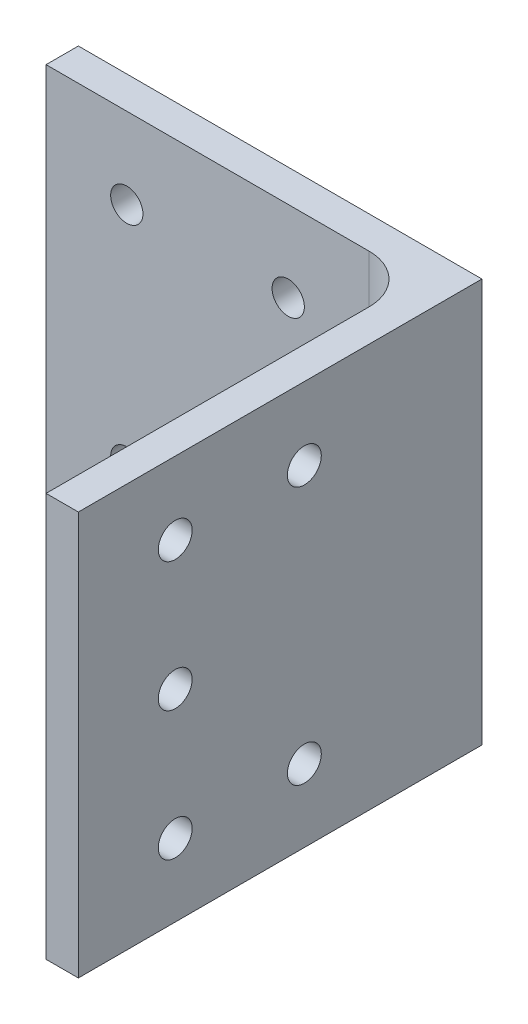
ISO-10303-21;
HEADER;
FILE_DESCRIPTION(('STEP AP214'),'2;1');
FILE_NAME('part.step','',(''),(''),'','','');
FILE_SCHEMA(('AUTOMOTIVE_DESIGN { 1 0 10303 214 1 1 1 1 }'));
ENDSEC;
DATA;
#1=APPLICATION_CONTEXT('core data for automotive mechanical design processes');
#2=APPLICATION_PROTOCOL_DEFINITION('international standard','automotive_design',2000,#1);
#3=PRODUCT_CONTEXT('',#1,'mechanical');
#4=PRODUCT('Part','Part','',(#3));
#5=PRODUCT_RELATED_PRODUCT_CATEGORY('part','',(#4));
#6=PRODUCT_DEFINITION_FORMATION('','',#4);
#7=PRODUCT_DEFINITION_CONTEXT('part definition',#1,'design');
#8=PRODUCT_DEFINITION('design','',#6,#7);
#9=PRODUCT_DEFINITION_SHAPE('','',#8);
#10=(LENGTH_UNIT() NAMED_UNIT(*) SI_UNIT(.MILLI.,.METRE.));
#11=(NAMED_UNIT(*) PLANE_ANGLE_UNIT() SI_UNIT($,.RADIAN.));
#12=(NAMED_UNIT(*) SI_UNIT($,.STERADIAN.) SOLID_ANGLE_UNIT());
#13=UNCERTAINTY_MEASURE_WITH_UNIT(LENGTH_MEASURE(1.E-05),#10,'distance_accuracy_value','');
#14=(GEOMETRIC_REPRESENTATION_CONTEXT(3) GLOBAL_UNCERTAINTY_ASSIGNED_CONTEXT((#13)) GLOBAL_UNIT_ASSIGNED_CONTEXT((#10,
#11,#12)) REPRESENTATION_CONTEXT('',''));
#15=CARTESIAN_POINT('',(0.,0.,0.));
#16=DIRECTION('',(0.,0.,1.));
#17=DIRECTION('',(1.,0.,0.));
#18=AXIS2_PLACEMENT_3D('',#15,#16,#17);
#19=CARTESIAN_POINT('',(-25.,25.,0.));
#20=DIRECTION('',(-1.,0.,0.));
#21=DIRECTION('',(0.,0.,1.));
#22=AXIS2_PLACEMENT_3D('',#19,#20,#21);
#23=PLANE('',#22);
#24=DIRECTION('',(0.,-1.,0.));
#25=VECTOR('',#24,1.);
#26=CARTESIAN_POINT('',(-25.,25.,2.));
#27=LINE('',#26,#25);
#28=CARTESIAN_POINT('',(-25.,25.,2.));
#29=VERTEX_POINT('',#28);
#30=CARTESIAN_POINT('',(-25.,0.,2.));
#31=VERTEX_POINT('',#30);
#32=EDGE_CURVE('E92',#29,#31,#27,.T.);
#33=ORIENTED_EDGE('',*,*,#32,.F.);
#34=DIRECTION('',(0.,0.,1.));
#35=VECTOR('',#34,1.);
#36=CARTESIAN_POINT('',(-25.,25.,0.));
#37=LINE('',#36,#35);
#38=CARTESIAN_POINT('',(-25.,25.,0.));
#39=VERTEX_POINT('',#38);
#40=EDGE_CURVE('E102',#39,#29,#37,.T.);
#41=ORIENTED_EDGE('',*,*,#40,.F.);
#42=DIRECTION('',(0.,-1.,0.));
#43=VECTOR('',#42,1.);
#44=CARTESIAN_POINT('',(-25.,25.,0.));
#45=LINE('',#44,#43);
#46=CARTESIAN_POINT('',(-25.,0.,0.));
#47=VERTEX_POINT('',#46);
#48=EDGE_CURVE('E191',#39,#47,#45,.T.);
#49=ORIENTED_EDGE('',*,*,#48,.T.);
#50=DIRECTION('',(0.,0.,1.));
#51=VECTOR('',#50,1.);
#52=CARTESIAN_POINT('',(-25.,0.,0.));
#53=LINE('',#52,#51);
#54=EDGE_CURVE('E104',#47,#31,#53,.T.);
#55=ORIENTED_EDGE('',*,*,#54,.T.);
#56=EDGE_LOOP('',(#33,#41,#49,#55));
#57=FACE_BOUND('',#56,.T.);
#58=ADVANCED_FACE('F34',(#57),#23,.T.);
#59=CARTESIAN_POINT('',(0.,25.,0.));
#60=DIRECTION('',(0.,1.,0.));
#61=DIRECTION('',(0.,0.,1.));
#62=AXIS2_PLACEMENT_3D('',#59,#60,#61);
#63=PLANE('',#62);
#64=DIRECTION('',(1.,0.,0.));
#65=VECTOR('',#64,1.);
#66=CARTESIAN_POINT('',(-25.,25.,2.));
#67=LINE('',#66,#65);
#68=CARTESIAN_POINT('',(-5.,25.,2.));
#69=VERTEX_POINT('',#68);
#70=EDGE_CURVE('E89',#29,#69,#67,.T.);
#71=ORIENTED_EDGE('',*,*,#70,.T.);
#72=CARTESIAN_POINT('',(-5.,25.,5.));
#73=DIRECTION('',(0.,1.,0.));
#74=DIRECTION('',(0.,0.,1.));
#75=AXIS2_PLACEMENT_3D('',#72,#73,#74);
#76=CIRCLE('',#75,3.);
#77=CARTESIAN_POINT('',(-2.,25.,5.));
#78=VERTEX_POINT('',#77);
#79=EDGE_CURVE('E11',#69,#78,#76,.F.);
#80=ORIENTED_EDGE('',*,*,#79,.T.);
#81=DIRECTION('',(0.,0.,1.));
#82=VECTOR('',#81,1.);
#83=CARTESIAN_POINT('',(-2.,25.,2.));
#84=LINE('',#83,#82);
#85=CARTESIAN_POINT('',(-2.,25.,25.));
#86=VERTEX_POINT('',#85);
#87=EDGE_CURVE('E96',#78,#86,#84,.T.);
#88=ORIENTED_EDGE('',*,*,#87,.T.);
#89=DIRECTION('',(-1.,0.,0.));
#90=VECTOR('',#89,1.);
#91=CARTESIAN_POINT('',(0.,25.,25.));
#92=LINE('',#91,#90);
#93=CARTESIAN_POINT('',(0.,25.,25.));
#94=VERTEX_POINT('',#93);
#95=EDGE_CURVE('E119',#94,#86,#92,.T.);
#96=ORIENTED_EDGE('',*,*,#95,.F.);
#97=DIRECTION('',(0.,0.,1.));
#98=VECTOR('',#97,1.);
#99=CARTESIAN_POINT('',(0.,25.,0.));
#100=LINE('',#99,#98);
#101=CARTESIAN_POINT('',(0.,25.,0.));
#102=VERTEX_POINT('',#101);
#103=EDGE_CURVE('E112',#102,#94,#100,.T.);
#104=ORIENTED_EDGE('',*,*,#103,.F.);
#105=DIRECTION('',(-1.,0.,0.));
#106=VECTOR('',#105,1.);
#107=CARTESIAN_POINT('',(0.,25.,0.));
#108=LINE('',#107,#106);
#109=EDGE_CURVE('E110',#102,#39,#108,.T.);
#110=ORIENTED_EDGE('',*,*,#109,.T.);
#111=ORIENTED_EDGE('',*,*,#40,.T.);
#112=EDGE_LOOP('',(#71,#80,#88,#96,#104,#110,#111));
#113=FACE_BOUND('',#112,.T.);
#114=ADVANCED_FACE('F108',(#113),#63,.T.);
#115=CARTESIAN_POINT('',(0.,0.,0.));
#116=DIRECTION('',(1.,0.,0.));
#117=DIRECTION('',(0.,0.,-1.));
#118=AXIS2_PLACEMENT_3D('',#115,#116,#117);
#119=PLANE('',#118);
#120=CARTESIAN_POINT('',(0.,20.5,19.));
#121=DIRECTION('',(1.,0.,0.));
#122=DIRECTION('',(0.,0.,-1.));
#123=AXIS2_PLACEMENT_3D('',#120,#121,#122);
#124=CIRCLE('',#123,1.04999999999998);
#125=CARTESIAN_POINT('',(0.,20.5,17.95));
#126=VERTEX_POINT('',#125);
#127=EDGE_CURVE('E133',#126,#126,#124,.T.);
#128=ORIENTED_EDGE('',*,*,#127,.F.);
#129=EDGE_LOOP('',(#128));
#130=FACE_BOUND('',#129,.T.);
#131=CARTESIAN_POINT('',(0.,4.5,19.));
#132=DIRECTION('',(1.,0.,0.));
#133=DIRECTION('',(0.,0.,-1.));
#134=AXIS2_PLACEMENT_3D('',#131,#132,#133);
#135=CIRCLE('',#134,1.04999999999999);
#136=CARTESIAN_POINT('',(0.,4.5,17.95));
#137=VERTEX_POINT('',#136);
#138=EDGE_CURVE('E132',#137,#137,#135,.T.);
#139=ORIENTED_EDGE('',*,*,#138,.F.);
#140=EDGE_LOOP('',(#139));
#141=FACE_BOUND('',#140,.T.);
#142=CARTESIAN_POINT('',(0.,12.5,19.));
#143=DIRECTION('',(1.,0.,0.));
#144=DIRECTION('',(0.,0.,-1.));
#145=AXIS2_PLACEMENT_3D('',#142,#143,#144);
#146=CIRCLE('',#145,1.04999999999999);
#147=CARTESIAN_POINT('',(0.,12.5,17.95));
#148=VERTEX_POINT('',#147);
#149=EDGE_CURVE('E129',#148,#148,#146,.T.);
#150=ORIENTED_EDGE('',*,*,#149,.F.);
#151=EDGE_LOOP('',(#150));
#152=FACE_BOUND('',#151,.T.);
#153=CARTESIAN_POINT('',(0.,4.5,11.));
#154=DIRECTION('',(1.,0.,0.));
#155=DIRECTION('',(0.,0.,-1.));
#156=AXIS2_PLACEMENT_3D('',#153,#154,#155);
#157=CIRCLE('',#156,1.04999999999999);
#158=CARTESIAN_POINT('',(0.,4.5,9.95000000000001));
#159=VERTEX_POINT('',#158);
#160=EDGE_CURVE('E128',#159,#159,#157,.T.);
#161=ORIENTED_EDGE('',*,*,#160,.F.);
#162=EDGE_LOOP('',(#161));
#163=FACE_BOUND('',#162,.T.);
#164=CARTESIAN_POINT('',(0.,20.5,11.));
#165=DIRECTION('',(1.,0.,0.));
#166=DIRECTION('',(0.,0.,-1.));
#167=AXIS2_PLACEMENT_3D('',#164,#165,#166);
#168=CIRCLE('',#167,1.04999999999998);
#169=CARTESIAN_POINT('',(0.,20.5,9.95000000000001));
#170=VERTEX_POINT('',#169);
#171=EDGE_CURVE('E154',#170,#170,#168,.T.);
#172=ORIENTED_EDGE('',*,*,#171,.F.);
#173=EDGE_LOOP('',(#172));
#174=FACE_BOUND('',#173,.T.);
#175=DIRECTION('',(0.,1.,0.));
#176=VECTOR('',#175,1.);
#177=CARTESIAN_POINT('',(0.,0.,25.));
#178=LINE('',#177,#176);
#179=CARTESIAN_POINT('',(0.,0.,25.));
#180=VERTEX_POINT('',#179);
#181=EDGE_CURVE('E200',#180,#94,#178,.T.);
#182=ORIENTED_EDGE('',*,*,#181,.F.);
#183=DIRECTION('',(0.,0.,1.));
#184=VECTOR('',#183,1.);
#185=CARTESIAN_POINT('',(0.,0.,0.));
#186=LINE('',#185,#184);
#187=CARTESIAN_POINT('',(0.,0.,0.));
#188=VERTEX_POINT('',#187);
#189=EDGE_CURVE('E116',#188,#180,#186,.T.);
#190=ORIENTED_EDGE('',*,*,#189,.F.);
#191=DIRECTION('',(0.,1.,0.));
#192=VECTOR('',#191,1.);
#193=CARTESIAN_POINT('',(0.,0.,0.));
#194=LINE('',#193,#192);
#195=EDGE_CURVE('E196',#188,#102,#194,.T.);
#196=ORIENTED_EDGE('',*,*,#195,.T.);
#197=ORIENTED_EDGE('',*,*,#103,.T.);
#198=EDGE_LOOP('',(#182,#190,#196,#197));
#199=FACE_BOUND('',#198,.T.);
#200=ADVANCED_FACE('F217',(#130,#141,#152,#163,#174,#199),#119,.T.);
#201=CARTESIAN_POINT('',(-25.,0.,0.));
#202=DIRECTION('',(0.,-1.,0.));
#203=DIRECTION('',(0.,0.,-1.));
#204=AXIS2_PLACEMENT_3D('',#201,#202,#203);
#205=PLANE('',#204);
#206=DIRECTION('',(0.,0.,1.));
#207=VECTOR('',#206,1.);
#208=CARTESIAN_POINT('',(-2.,0.,2.));
#209=LINE('',#208,#207);
#210=CARTESIAN_POINT('',(-2.,0.,5.));
#211=VERTEX_POINT('',#210);
#212=CARTESIAN_POINT('',(-2.,0.,25.));
#213=VERTEX_POINT('',#212);
#214=EDGE_CURVE('E97',#211,#213,#209,.T.);
#215=ORIENTED_EDGE('',*,*,#214,.F.);
#216=CARTESIAN_POINT('',(-5.,0.,5.));
#217=DIRECTION('',(0.,-1.,0.));
#218=DIRECTION('',(0.,0.,-1.));
#219=AXIS2_PLACEMENT_3D('',#216,#217,#218);
#220=CIRCLE('',#219,3.);
#221=CARTESIAN_POINT('',(-5.,0.,2.));
#222=VERTEX_POINT('',#221);
#223=EDGE_CURVE('E42',#211,#222,#220,.F.);
#224=ORIENTED_EDGE('',*,*,#223,.T.);
#225=DIRECTION('',(1.,0.,0.));
#226=VECTOR('',#225,1.);
#227=CARTESIAN_POINT('',(-25.,0.,2.));
#228=LINE('',#227,#226);
#229=EDGE_CURVE('E183',#31,#222,#228,.T.);
#230=ORIENTED_EDGE('',*,*,#229,.F.);
#231=ORIENTED_EDGE('',*,*,#54,.F.);
#232=DIRECTION('',(1.,0.,0.));
#233=VECTOR('',#232,1.);
#234=CARTESIAN_POINT('',(-25.,0.,0.));
#235=LINE('',#234,#233);
#236=EDGE_CURVE('E193',#47,#188,#235,.T.);
#237=ORIENTED_EDGE('',*,*,#236,.T.);
#238=ORIENTED_EDGE('',*,*,#189,.T.);
#239=DIRECTION('',(1.,0.,0.));
#240=VECTOR('',#239,1.);
#241=CARTESIAN_POINT('',(-25.,0.,25.));
#242=LINE('',#241,#240);
#243=EDGE_CURVE('E189',#213,#180,#242,.T.);
#244=ORIENTED_EDGE('',*,*,#243,.F.);
#245=EDGE_LOOP('',(#215,#224,#230,#231,#237,#238,#244));
#246=FACE_BOUND('',#245,.T.);
#247=ADVANCED_FACE('F213',(#246),#205,.T.);
#248=CARTESIAN_POINT('',(0.,0.,0.));
#249=DIRECTION('',(0.,0.,1.));
#250=DIRECTION('',(1.,0.,0.));
#251=AXIS2_PLACEMENT_3D('',#248,#249,#250);
#252=PLANE('',#251);
#253=CARTESIAN_POINT('',(-10.,20.,0.));
#254=DIRECTION('',(0.,0.,1.));
#255=DIRECTION('',(1.,0.,0.));
#256=AXIS2_PLACEMENT_3D('',#253,#254,#255);
#257=CIRCLE('',#256,0.999999999999987);
#258=CARTESIAN_POINT('',(-9.00000000000001,20.,0.));
#259=VERTEX_POINT('',#258);
#260=EDGE_CURVE('E163',#259,#259,#257,.T.);
#261=ORIENTED_EDGE('',*,*,#260,.T.);
#262=EDGE_LOOP('',(#261));
#263=FACE_BOUND('',#262,.T.);
#264=CARTESIAN_POINT('',(-10.,6.,0.));
#265=DIRECTION('',(0.,0.,1.));
#266=DIRECTION('',(1.,0.,0.));
#267=AXIS2_PLACEMENT_3D('',#264,#265,#266);
#268=CIRCLE('',#267,0.999999999999987);
#269=CARTESIAN_POINT('',(-9.00000000000001,6.,0.));
#270=VERTEX_POINT('',#269);
#271=EDGE_CURVE('E169',#270,#270,#268,.T.);
#272=ORIENTED_EDGE('',*,*,#271,.T.);
#273=EDGE_LOOP('',(#272));
#274=FACE_BOUND('',#273,.T.);
#275=CARTESIAN_POINT('',(-20.,6.,0.));
#276=DIRECTION('',(0.,0.,1.));
#277=DIRECTION('',(1.,0.,0.));
#278=AXIS2_PLACEMENT_3D('',#275,#276,#277);
#279=CIRCLE('',#278,0.999999999999987);
#280=CARTESIAN_POINT('',(-19.,6.,0.));
#281=VERTEX_POINT('',#280);
#282=EDGE_CURVE('E175',#281,#281,#279,.T.);
#283=ORIENTED_EDGE('',*,*,#282,.T.);
#284=EDGE_LOOP('',(#283));
#285=FACE_BOUND('',#284,.T.);
#286=CARTESIAN_POINT('',(-20.,19.9882541699118,0.));
#287=DIRECTION('',(0.,0.,1.));
#288=DIRECTION('',(1.,0.,0.));
#289=AXIS2_PLACEMENT_3D('',#286,#287,#288);
#290=CIRCLE('',#289,0.999999999999987);
#291=CARTESIAN_POINT('',(-19.,19.9882541699118,0.));
#292=VERTEX_POINT('',#291);
#293=EDGE_CURVE('E181',#292,#292,#290,.T.);
#294=ORIENTED_EDGE('',*,*,#293,.T.);
#295=EDGE_LOOP('',(#294));
#296=FACE_BOUND('',#295,.T.);
#297=ORIENTED_EDGE('',*,*,#48,.F.);
#298=ORIENTED_EDGE('',*,*,#109,.F.);
#299=ORIENTED_EDGE('',*,*,#195,.F.);
#300=ORIENTED_EDGE('',*,*,#236,.F.);
#301=EDGE_LOOP('',(#297,#298,#299,#300));
#302=FACE_BOUND('',#301,.T.);
#303=ADVANCED_FACE('F219',(#263,#274,#285,#296,#302),#252,.F.);
#304=CARTESIAN_POINT('',(0.,0.,25.));
#305=DIRECTION('',(0.,0.,1.));
#306=DIRECTION('',(1.,0.,0.));
#307=AXIS2_PLACEMENT_3D('',#304,#305,#306);
#308=PLANE('',#307);
#309=DIRECTION('',(0.,-1.,0.));
#310=VECTOR('',#309,1.);
#311=CARTESIAN_POINT('',(-2.,25.,25.));
#312=LINE('',#311,#310);
#313=EDGE_CURVE('E105',#86,#213,#312,.T.);
#314=ORIENTED_EDGE('',*,*,#313,.T.);
#315=ORIENTED_EDGE('',*,*,#243,.T.);
#316=ORIENTED_EDGE('',*,*,#181,.T.);
#317=ORIENTED_EDGE('',*,*,#95,.T.);
#318=EDGE_LOOP('',(#314,#315,#316,#317));
#319=FACE_BOUND('',#318,.T.);
#320=ADVANCED_FACE('F206',(#319),#308,.T.);
#321=CARTESIAN_POINT('',(-2.,25.,2.));
#322=DIRECTION('',(1.,0.,0.));
#323=DIRECTION('',(0.,0.,-1.));
#324=AXIS2_PLACEMENT_3D('',#321,#322,#323);
#325=PLANE('',#324);
#326=CARTESIAN_POINT('',(-2.,20.5,19.));
#327=DIRECTION('',(1.,0.,0.));
#328=DIRECTION('',(0.,0.,-1.));
#329=AXIS2_PLACEMENT_3D('',#326,#327,#328);
#330=CIRCLE('',#329,1.04999999999998);
#331=CARTESIAN_POINT('',(-2.,20.5,17.95));
#332=VERTEX_POINT('',#331);
#333=EDGE_CURVE('E130',#332,#332,#330,.T.);
#334=ORIENTED_EDGE('',*,*,#333,.T.);
#335=EDGE_LOOP('',(#334));
#336=FACE_BOUND('',#335,.T.);
#337=CARTESIAN_POINT('',(-2.,4.5,19.));
#338=DIRECTION('',(1.,0.,0.));
#339=DIRECTION('',(0.,0.,-1.));
#340=AXIS2_PLACEMENT_3D('',#337,#338,#339);
#341=CIRCLE('',#340,1.04999999999998);
#342=CARTESIAN_POINT('',(-2.,4.5,17.95));
#343=VERTEX_POINT('',#342);
#344=EDGE_CURVE('E138',#343,#343,#341,.T.);
#345=ORIENTED_EDGE('',*,*,#344,.T.);
#346=EDGE_LOOP('',(#345));
#347=FACE_BOUND('',#346,.T.);
#348=CARTESIAN_POINT('',(-2.,12.5,19.));
#349=DIRECTION('',(1.,0.,0.));
#350=DIRECTION('',(0.,0.,-1.));
#351=AXIS2_PLACEMENT_3D('',#348,#349,#350);
#352=CIRCLE('',#351,1.04999999999998);
#353=CARTESIAN_POINT('',(-2.,12.5,17.95));
#354=VERTEX_POINT('',#353);
#355=EDGE_CURVE('E125',#354,#354,#352,.T.);
#356=ORIENTED_EDGE('',*,*,#355,.T.);
#357=EDGE_LOOP('',(#356));
#358=FACE_BOUND('',#357,.T.);
#359=CARTESIAN_POINT('',(-2.,4.5,11.));
#360=DIRECTION('',(1.,0.,0.));
#361=DIRECTION('',(0.,0.,-1.));
#362=AXIS2_PLACEMENT_3D('',#359,#360,#361);
#363=CIRCLE('',#362,1.04999999999998);
#364=CARTESIAN_POINT('',(-2.,4.5,9.95000000000001));
#365=VERTEX_POINT('',#364);
#366=EDGE_CURVE('E151',#365,#365,#363,.T.);
#367=ORIENTED_EDGE('',*,*,#366,.T.);
#368=EDGE_LOOP('',(#367));
#369=FACE_BOUND('',#368,.T.);
#370=CARTESIAN_POINT('',(-2.,20.5,11.));
#371=DIRECTION('',(1.,0.,0.));
#372=DIRECTION('',(0.,0.,-1.));
#373=AXIS2_PLACEMENT_3D('',#370,#371,#372);
#374=CIRCLE('',#373,1.04999999999998);
#375=CARTESIAN_POINT('',(-2.,20.5,9.95000000000001));
#376=VERTEX_POINT('',#375);
#377=EDGE_CURVE('E157',#376,#376,#374,.T.);
#378=ORIENTED_EDGE('',*,*,#377,.T.);
#379=EDGE_LOOP('',(#378));
#380=FACE_BOUND('',#379,.T.);
#381=ORIENTED_EDGE('',*,*,#87,.F.);
#382=DIRECTION('',(0.,-1.,0.));
#383=VECTOR('',#382,1.);
#384=CARTESIAN_POINT('',(-2.,0.,5.));
#385=LINE('',#384,#383);
#386=EDGE_CURVE('E111',#78,#211,#385,.T.);
#387=ORIENTED_EDGE('',*,*,#386,.T.);
#388=ORIENTED_EDGE('',*,*,#214,.T.);
#389=ORIENTED_EDGE('',*,*,#313,.F.);
#390=EDGE_LOOP('',(#381,#387,#388,#389));
#391=FACE_BOUND('',#390,.T.);
#392=ADVANCED_FACE('F212',(#336,#347,#358,#369,#380,#391),#325,.F.);
#393=CARTESIAN_POINT('',(-25.,25.,2.));
#394=DIRECTION('',(0.,0.,-1.));
#395=DIRECTION('',(-1.,0.,0.));
#396=AXIS2_PLACEMENT_3D('',#393,#394,#395);
#397=PLANE('',#396);
#398=CARTESIAN_POINT('',(-10.,20.,2.));
#399=DIRECTION('',(0.,0.,1.));
#400=DIRECTION('',(1.,0.,0.));
#401=AXIS2_PLACEMENT_3D('',#398,#399,#400);
#402=CIRCLE('',#401,0.999999999999987);
#403=CARTESIAN_POINT('',(-9.00000000000001,20.,2.));
#404=VERTEX_POINT('',#403);
#405=EDGE_CURVE('E160',#404,#404,#402,.T.);
#406=ORIENTED_EDGE('',*,*,#405,.F.);
#407=EDGE_LOOP('',(#406));
#408=FACE_BOUND('',#407,.T.);
#409=CARTESIAN_POINT('',(-10.,6.,2.));
#410=DIRECTION('',(0.,0.,1.));
#411=DIRECTION('',(1.,0.,0.));
#412=AXIS2_PLACEMENT_3D('',#409,#410,#411);
#413=CIRCLE('',#412,0.999999999999987);
#414=CARTESIAN_POINT('',(-9.00000000000001,6.,2.));
#415=VERTEX_POINT('',#414);
#416=EDGE_CURVE('E166',#415,#415,#413,.T.);
#417=ORIENTED_EDGE('',*,*,#416,.F.);
#418=EDGE_LOOP('',(#417));
#419=FACE_BOUND('',#418,.T.);
#420=CARTESIAN_POINT('',(-20.,6.,2.));
#421=DIRECTION('',(0.,0.,1.));
#422=DIRECTION('',(1.,0.,0.));
#423=AXIS2_PLACEMENT_3D('',#420,#421,#422);
#424=CIRCLE('',#423,0.999999999999987);
#425=CARTESIAN_POINT('',(-19.,6.,2.));
#426=VERTEX_POINT('',#425);
#427=EDGE_CURVE('E172',#426,#426,#424,.T.);
#428=ORIENTED_EDGE('',*,*,#427,.F.);
#429=EDGE_LOOP('',(#428));
#430=FACE_BOUND('',#429,.T.);
#431=CARTESIAN_POINT('',(-20.,19.9882541699118,2.));
#432=DIRECTION('',(0.,0.,1.));
#433=DIRECTION('',(1.,0.,0.));
#434=AXIS2_PLACEMENT_3D('',#431,#432,#433);
#435=CIRCLE('',#434,0.999999999999987);
#436=CARTESIAN_POINT('',(-19.,19.9882541699118,2.));
#437=VERTEX_POINT('',#436);
#438=EDGE_CURVE('E178',#437,#437,#435,.T.);
#439=ORIENTED_EDGE('',*,*,#438,.F.);
#440=EDGE_LOOP('',(#439));
#441=FACE_BOUND('',#440,.T.);
#442=ORIENTED_EDGE('',*,*,#229,.T.);
#443=DIRECTION('',(0.,-1.,0.));
#444=VECTOR('',#443,1.);
#445=CARTESIAN_POINT('',(-5.,25.,2.));
#446=LINE('',#445,#444);
#447=EDGE_CURVE('E49',#222,#69,#446,.F.);
#448=ORIENTED_EDGE('',*,*,#447,.T.);
#449=ORIENTED_EDGE('',*,*,#70,.F.);
#450=ORIENTED_EDGE('',*,*,#32,.T.);
#451=EDGE_LOOP('',(#442,#448,#449,#450));
#452=FACE_BOUND('',#451,.T.);
#453=ADVANCED_FACE('F91',(#408,#419,#430,#441,#452),#397,.F.);
#454=CARTESIAN_POINT('',(-20.,19.9882541699118,2.));
#455=DIRECTION('',(0.,0.,1.));
#456=DIRECTION('',(1.,0.,0.));
#457=AXIS2_PLACEMENT_3D('',#454,#455,#456);
#458=CYLINDRICAL_SURFACE('',#457,0.999999999999987);
#459=ORIENTED_EDGE('',*,*,#293,.F.);
#460=EDGE_LOOP('',(#459));
#461=FACE_BOUND('',#460,.T.);
#462=ORIENTED_EDGE('',*,*,#438,.T.);
#463=EDGE_LOOP('',(#462));
#464=FACE_BOUND('',#463,.T.);
#465=ADVANCED_FACE('F263',(#461,#464),#458,.F.);
#466=CARTESIAN_POINT('',(-20.,6.,2.));
#467=DIRECTION('',(0.,0.,1.));
#468=DIRECTION('',(1.,0.,0.));
#469=AXIS2_PLACEMENT_3D('',#466,#467,#468);
#470=CYLINDRICAL_SURFACE('',#469,0.999999999999987);
#471=ORIENTED_EDGE('',*,*,#282,.F.);
#472=EDGE_LOOP('',(#471));
#473=FACE_BOUND('',#472,.T.);
#474=ORIENTED_EDGE('',*,*,#427,.T.);
#475=EDGE_LOOP('',(#474));
#476=FACE_BOUND('',#475,.T.);
#477=ADVANCED_FACE('F269',(#473,#476),#470,.F.);
#478=CARTESIAN_POINT('',(-10.,6.,2.));
#479=DIRECTION('',(0.,0.,1.));
#480=DIRECTION('',(1.,0.,0.));
#481=AXIS2_PLACEMENT_3D('',#478,#479,#480);
#482=CYLINDRICAL_SURFACE('',#481,0.999999999999987);
#483=ORIENTED_EDGE('',*,*,#271,.F.);
#484=EDGE_LOOP('',(#483));
#485=FACE_BOUND('',#484,.T.);
#486=ORIENTED_EDGE('',*,*,#416,.T.);
#487=EDGE_LOOP('',(#486));
#488=FACE_BOUND('',#487,.T.);
#489=ADVANCED_FACE('F273',(#485,#488),#482,.F.);
#490=CARTESIAN_POINT('',(-10.,20.,2.));
#491=DIRECTION('',(0.,0.,1.));
#492=DIRECTION('',(1.,0.,0.));
#493=AXIS2_PLACEMENT_3D('',#490,#491,#492);
#494=CYLINDRICAL_SURFACE('',#493,0.999999999999987);
#495=ORIENTED_EDGE('',*,*,#260,.F.);
#496=EDGE_LOOP('',(#495));
#497=FACE_BOUND('',#496,.T.);
#498=ORIENTED_EDGE('',*,*,#405,.T.);
#499=EDGE_LOOP('',(#498));
#500=FACE_BOUND('',#499,.T.);
#501=ADVANCED_FACE('F254',(#497,#500),#494,.F.);
#502=CARTESIAN_POINT('',(0.,20.5,11.));
#503=DIRECTION('',(1.,0.,0.));
#504=DIRECTION('',(0.,0.,-1.));
#505=AXIS2_PLACEMENT_3D('',#502,#503,#504);
#506=CYLINDRICAL_SURFACE('',#505,1.04999999999998);
#507=ORIENTED_EDGE('',*,*,#171,.T.);
#508=EDGE_LOOP('',(#507));
#509=FACE_BOUND('',#508,.T.);
#510=ORIENTED_EDGE('',*,*,#377,.F.);
#511=EDGE_LOOP('',(#510));
#512=FACE_BOUND('',#511,.T.);
#513=ADVANCED_FACE('F250',(#509,#512),#506,.F.);
#514=CARTESIAN_POINT('',(0.,4.5,11.));
#515=DIRECTION('',(1.,0.,0.));
#516=DIRECTION('',(0.,0.,-1.));
#517=AXIS2_PLACEMENT_3D('',#514,#515,#516);
#518=CYLINDRICAL_SURFACE('',#517,1.04999999999998);
#519=ORIENTED_EDGE('',*,*,#160,.T.);
#520=EDGE_LOOP('',(#519));
#521=FACE_BOUND('',#520,.T.);
#522=ORIENTED_EDGE('',*,*,#366,.F.);
#523=EDGE_LOOP('',(#522));
#524=FACE_BOUND('',#523,.T.);
#525=ADVANCED_FACE('F253',(#521,#524),#518,.F.);
#526=CARTESIAN_POINT('',(0.,12.5,19.));
#527=DIRECTION('',(1.,0.,0.));
#528=DIRECTION('',(0.,0.,-1.));
#529=AXIS2_PLACEMENT_3D('',#526,#527,#528);
#530=CYLINDRICAL_SURFACE('',#529,1.04999999999998);
#531=ORIENTED_EDGE('',*,*,#149,.T.);
#532=EDGE_LOOP('',(#531));
#533=FACE_BOUND('',#532,.T.);
#534=ORIENTED_EDGE('',*,*,#355,.F.);
#535=EDGE_LOOP('',(#534));
#536=FACE_BOUND('',#535,.T.);
#537=ADVANCED_FACE('F283',(#533,#536),#530,.F.);
#538=CARTESIAN_POINT('',(0.,4.5,19.));
#539=DIRECTION('',(1.,0.,0.));
#540=DIRECTION('',(0.,0.,-1.));
#541=AXIS2_PLACEMENT_3D('',#538,#539,#540);
#542=CYLINDRICAL_SURFACE('',#541,1.04999999999998);
#543=ORIENTED_EDGE('',*,*,#138,.T.);
#544=EDGE_LOOP('',(#543));
#545=FACE_BOUND('',#544,.T.);
#546=ORIENTED_EDGE('',*,*,#344,.F.);
#547=EDGE_LOOP('',(#546));
#548=FACE_BOUND('',#547,.T.);
#549=ADVANCED_FACE('F287',(#545,#548),#542,.F.);
#550=CARTESIAN_POINT('',(0.,20.5,19.));
#551=DIRECTION('',(1.,0.,0.));
#552=DIRECTION('',(0.,0.,-1.));
#553=AXIS2_PLACEMENT_3D('',#550,#551,#552);
#554=CYLINDRICAL_SURFACE('',#553,1.04999999999998);
#555=ORIENTED_EDGE('',*,*,#127,.T.);
#556=EDGE_LOOP('',(#555));
#557=FACE_BOUND('',#556,.T.);
#558=ORIENTED_EDGE('',*,*,#333,.F.);
#559=EDGE_LOOP('',(#558));
#560=FACE_BOUND('',#559,.T.);
#561=ADVANCED_FACE('F291',(#557,#560),#554,.F.);
#562=CARTESIAN_POINT('',(-5.,25.,5.));
#563=DIRECTION('',(0.,1.,0.));
#564=DIRECTION('',(0.,0.,1.));
#565=AXIS2_PLACEMENT_3D('',#562,#563,#564);
#566=CYLINDRICAL_SURFACE('',#565,3.);
#567=ORIENTED_EDGE('',*,*,#79,.F.);
#568=ORIENTED_EDGE('',*,*,#447,.F.);
#569=ORIENTED_EDGE('',*,*,#223,.F.);
#570=ORIENTED_EDGE('',*,*,#386,.F.);
#571=EDGE_LOOP('',(#567,#568,#569,#570));
#572=FACE_BOUND('',#571,.T.);
#573=ADVANCED_FACE('F36',(#572),#566,.F.);
#574=CLOSED_SHELL('',(#58,#114,#200,#247,#303,#320,#392,#453,#465,#477,#489,#501,#513,#525,#537,
#549,#561,#573));
#575=MANIFOLD_SOLID_BREP('B2',#574);
#576=ADVANCED_BREP_SHAPE_REPRESENTATION('',(#18,#575),#14);
#577=SHAPE_DEFINITION_REPRESENTATION(#9,#576);
ENDSEC;
END-ISO-10303-21;
